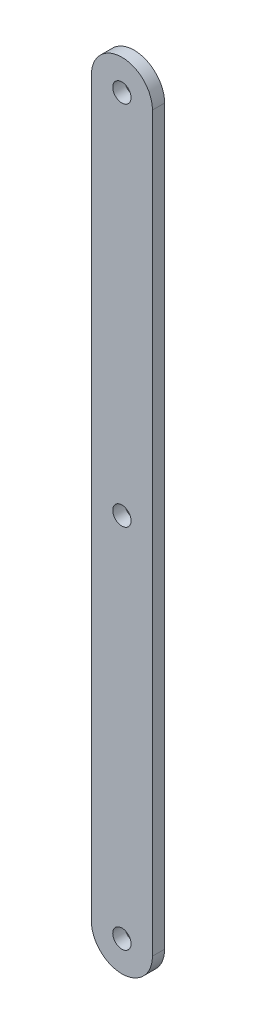
ISO-10303-21;
HEADER;
FILE_DESCRIPTION(('STEP AP214'),'2;1');
FILE_NAME('part.step','',(''),(''),'','','');
FILE_SCHEMA(('AUTOMOTIVE_DESIGN { 1 0 10303 214 1 1 1 1 }'));
ENDSEC;
DATA;
#1=APPLICATION_CONTEXT('core data for automotive mechanical design processes');
#2=APPLICATION_PROTOCOL_DEFINITION('international standard','automotive_design',2000,#1);
#3=PRODUCT_CONTEXT('',#1,'mechanical');
#4=PRODUCT('Part','Part','',(#3));
#5=PRODUCT_RELATED_PRODUCT_CATEGORY('part','',(#4));
#6=PRODUCT_DEFINITION_FORMATION('','',#4);
#7=PRODUCT_DEFINITION_CONTEXT('part definition',#1,'design');
#8=PRODUCT_DEFINITION('design','',#6,#7);
#9=PRODUCT_DEFINITION_SHAPE('','',#8);
#10=(LENGTH_UNIT() NAMED_UNIT(*) SI_UNIT(.MILLI.,.METRE.));
#11=(NAMED_UNIT(*) PLANE_ANGLE_UNIT() SI_UNIT($,.RADIAN.));
#12=(NAMED_UNIT(*) SI_UNIT($,.STERADIAN.) SOLID_ANGLE_UNIT());
#13=UNCERTAINTY_MEASURE_WITH_UNIT(LENGTH_MEASURE(1.E-05),#10,'distance_accuracy_value','');
#14=(GEOMETRIC_REPRESENTATION_CONTEXT(3) GLOBAL_UNCERTAINTY_ASSIGNED_CONTEXT((#13)) GLOBAL_UNIT_ASSIGNED_CONTEXT((#10,
#11,#12)) REPRESENTATION_CONTEXT('',''));
#15=CARTESIAN_POINT('',(0.,0.,0.));
#16=DIRECTION('',(0.,0.,1.));
#17=DIRECTION('',(1.,0.,0.));
#18=AXIS2_PLACEMENT_3D('',#15,#16,#17);
#19=CARTESIAN_POINT('',(0.,60.,2.));
#20=DIRECTION('',(0.,0.,1.));
#21=DIRECTION('',(1.,0.,0.));
#22=AXIS2_PLACEMENT_3D('',#19,#20,#21);
#23=PLANE('',#22);
#24=CARTESIAN_POINT('',(0.,-60.,2.));
#25=DIRECTION('',(0.,0.,1.));
#26=DIRECTION('',(-1.,0.,0.));
#27=AXIS2_PLACEMENT_3D('',#24,#25,#26);
#28=CIRCLE('',#27,1.5);
#29=CARTESIAN_POINT('',(-1.50000000000001,-60.,2.));
#30=VERTEX_POINT('',#29);
#31=EDGE_CURVE('E116',#30,#30,#28,.T.);
#32=ORIENTED_EDGE('',*,*,#31,.F.);
#33=EDGE_LOOP('',(#32));
#34=FACE_BOUND('',#33,.T.);
#35=CARTESIAN_POINT('',(0.,60.,2.));
#36=DIRECTION('',(0.,0.,1.));
#37=DIRECTION('',(1.,0.,0.));
#38=AXIS2_PLACEMENT_3D('',#35,#36,#37);
#39=CIRCLE('',#38,5.);
#40=CARTESIAN_POINT('',(5.00000000000001,60.,2.));
#41=VERTEX_POINT('',#40);
#42=CARTESIAN_POINT('',(-4.99999999999999,60.,2.));
#43=VERTEX_POINT('',#42);
#44=EDGE_CURVE('E86',#41,#43,#39,.T.);
#45=ORIENTED_EDGE('',*,*,#44,.T.);
#46=DIRECTION('',(0.,-1.,0.));
#47=VECTOR('',#46,1.);
#48=CARTESIAN_POINT('',(-4.99999999999999,60.,2.));
#49=LINE('',#48,#47);
#50=CARTESIAN_POINT('',(-5.00000000000001,-60.,2.));
#51=VERTEX_POINT('',#50);
#52=EDGE_CURVE('E81',#43,#51,#49,.T.);
#53=ORIENTED_EDGE('',*,*,#52,.T.);
#54=CARTESIAN_POINT('',(0.,-60.,2.));
#55=DIRECTION('',(0.,0.,1.));
#56=DIRECTION('',(1.,0.,0.));
#57=AXIS2_PLACEMENT_3D('',#54,#55,#56);
#58=CIRCLE('',#57,5.);
#59=CARTESIAN_POINT('',(5.00000000000001,-60.,2.));
#60=VERTEX_POINT('',#59);
#61=EDGE_CURVE('E84',#51,#60,#58,.T.);
#62=ORIENTED_EDGE('',*,*,#61,.T.);
#63=DIRECTION('',(0.,1.,0.));
#64=VECTOR('',#63,1.);
#65=CARTESIAN_POINT('',(5.00000000000001,60.,2.));
#66=LINE('',#65,#64);
#67=EDGE_CURVE('E51',#60,#41,#66,.T.);
#68=ORIENTED_EDGE('',*,*,#67,.T.);
#69=EDGE_LOOP('',(#45,#53,#62,#68));
#70=FACE_BOUND('',#69,.T.);
#71=CARTESIAN_POINT('',(0.,60.,2.));
#72=DIRECTION('',(0.,0.,1.));
#73=DIRECTION('',(1.,0.,0.));
#74=AXIS2_PLACEMENT_3D('',#71,#72,#73);
#75=CIRCLE('',#74,1.5);
#76=CARTESIAN_POINT('',(1.49999999999999,60.,2.));
#77=VERTEX_POINT('',#76);
#78=EDGE_CURVE('E101',#77,#77,#75,.T.);
#79=ORIENTED_EDGE('',*,*,#78,.F.);
#80=EDGE_LOOP('',(#79));
#81=FACE_BOUND('',#80,.T.);
#82=CARTESIAN_POINT('',(0.,0.,2.));
#83=DIRECTION('',(0.,0.,1.));
#84=DIRECTION('',(1.,0.,0.));
#85=AXIS2_PLACEMENT_3D('',#82,#83,#84);
#86=CIRCLE('',#85,1.5);
#87=CARTESIAN_POINT('',(1.5,0.,2.));
#88=VERTEX_POINT('',#87);
#89=EDGE_CURVE('E122',#88,#88,#86,.T.);
#90=ORIENTED_EDGE('',*,*,#89,.F.);
#91=EDGE_LOOP('',(#90));
#92=FACE_BOUND('',#91,.T.);
#93=ADVANCED_FACE('F34',(#34,#70,#81,#92),#23,.T.);
#94=CARTESIAN_POINT('',(0.,60.,0.));
#95=DIRECTION('',(0.,0.,1.));
#96=DIRECTION('',(1.,0.,0.));
#97=AXIS2_PLACEMENT_3D('',#94,#95,#96);
#98=PLANE('',#97);
#99=CARTESIAN_POINT('',(0.,60.,0.));
#100=DIRECTION('',(0.,0.,1.));
#101=DIRECTION('',(1.,0.,0.));
#102=AXIS2_PLACEMENT_3D('',#99,#100,#101);
#103=CIRCLE('',#102,5.);
#104=CARTESIAN_POINT('',(5.00000000000001,60.,0.));
#105=VERTEX_POINT('',#104);
#106=CARTESIAN_POINT('',(-4.99999999999999,60.,0.));
#107=VERTEX_POINT('',#106);
#108=EDGE_CURVE('E98',#105,#107,#103,.T.);
#109=ORIENTED_EDGE('',*,*,#108,.F.);
#110=DIRECTION('',(0.,1.,0.));
#111=VECTOR('',#110,1.);
#112=CARTESIAN_POINT('',(5.00000000000001,60.,0.));
#113=LINE('',#112,#111);
#114=CARTESIAN_POINT('',(5.00000000000001,-60.,0.));
#115=VERTEX_POINT('',#114);
#116=EDGE_CURVE('E74',#115,#105,#113,.T.);
#117=ORIENTED_EDGE('',*,*,#116,.F.);
#118=CARTESIAN_POINT('',(0.,-60.,0.));
#119=DIRECTION('',(0.,0.,1.));
#120=DIRECTION('',(1.,0.,0.));
#121=AXIS2_PLACEMENT_3D('',#118,#119,#120);
#122=CIRCLE('',#121,5.);
#123=CARTESIAN_POINT('',(-5.00000000000001,-60.,0.));
#124=VERTEX_POINT('',#123);
#125=EDGE_CURVE('E68',#124,#115,#122,.T.);
#126=ORIENTED_EDGE('',*,*,#125,.F.);
#127=DIRECTION('',(0.,-1.,0.));
#128=VECTOR('',#127,1.);
#129=CARTESIAN_POINT('',(-4.99999999999999,60.,0.));
#130=LINE('',#129,#128);
#131=EDGE_CURVE('E90',#107,#124,#130,.T.);
#132=ORIENTED_EDGE('',*,*,#131,.F.);
#133=EDGE_LOOP('',(#109,#117,#126,#132));
#134=FACE_BOUND('',#133,.T.);
#135=CARTESIAN_POINT('',(0.,60.,0.));
#136=DIRECTION('',(0.,0.,1.));
#137=DIRECTION('',(1.,0.,0.));
#138=AXIS2_PLACEMENT_3D('',#135,#136,#137);
#139=CIRCLE('',#138,1.5);
#140=CARTESIAN_POINT('',(1.49999999999999,60.,0.));
#141=VERTEX_POINT('',#140);
#142=EDGE_CURVE('E113',#141,#141,#139,.T.);
#143=ORIENTED_EDGE('',*,*,#142,.T.);
#144=EDGE_LOOP('',(#143));
#145=FACE_BOUND('',#144,.T.);
#146=CARTESIAN_POINT('',(0.,-60.,0.));
#147=DIRECTION('',(0.,0.,1.));
#148=DIRECTION('',(-1.,0.,0.));
#149=AXIS2_PLACEMENT_3D('',#146,#147,#148);
#150=CIRCLE('',#149,1.5);
#151=CARTESIAN_POINT('',(-1.50000000000001,-60.,0.));
#152=VERTEX_POINT('',#151);
#153=EDGE_CURVE('E119',#152,#152,#150,.T.);
#154=ORIENTED_EDGE('',*,*,#153,.T.);
#155=EDGE_LOOP('',(#154));
#156=FACE_BOUND('',#155,.T.);
#157=CARTESIAN_POINT('',(0.,0.,0.));
#158=DIRECTION('',(0.,0.,1.));
#159=DIRECTION('',(1.,0.,0.));
#160=AXIS2_PLACEMENT_3D('',#157,#158,#159);
#161=CIRCLE('',#160,1.5);
#162=CARTESIAN_POINT('',(1.5,0.,0.));
#163=VERTEX_POINT('',#162);
#164=EDGE_CURVE('E125',#163,#163,#161,.T.);
#165=ORIENTED_EDGE('',*,*,#164,.T.);
#166=EDGE_LOOP('',(#165));
#167=FACE_BOUND('',#166,.T.);
#168=ADVANCED_FACE('F109',(#134,#145,#156,#167),#98,.F.);
#169=CARTESIAN_POINT('',(0.,60.,2.));
#170=DIRECTION('',(0.,0.,-1.));
#171=DIRECTION('',(-1.,0.,0.));
#172=AXIS2_PLACEMENT_3D('',#169,#170,#171);
#173=CYLINDRICAL_SURFACE('',#172,5.);
#174=ORIENTED_EDGE('',*,*,#108,.T.);
#175=DIRECTION('',(0.,0.,-1.));
#176=VECTOR('',#175,1.);
#177=CARTESIAN_POINT('',(-4.99999999999999,60.,2.));
#178=LINE('',#177,#176);
#179=EDGE_CURVE('E11',#43,#107,#178,.T.);
#180=ORIENTED_EDGE('',*,*,#179,.F.);
#181=ORIENTED_EDGE('',*,*,#44,.F.);
#182=DIRECTION('',(0.,0.,-1.));
#183=VECTOR('',#182,1.);
#184=CARTESIAN_POINT('',(5.00000000000001,60.,2.));
#185=LINE('',#184,#183);
#186=EDGE_CURVE('E94',#41,#105,#185,.T.);
#187=ORIENTED_EDGE('',*,*,#186,.T.);
#188=EDGE_LOOP('',(#174,#180,#181,#187));
#189=FACE_BOUND('',#188,.T.);
#190=ADVANCED_FACE('F36',(#189),#173,.T.);
#191=CARTESIAN_POINT('',(-4.99999999999999,60.,2.));
#192=DIRECTION('',(1.,0.,0.));
#193=DIRECTION('',(0.,0.,-1.));
#194=AXIS2_PLACEMENT_3D('',#191,#192,#193);
#195=PLANE('',#194);
#196=ORIENTED_EDGE('',*,*,#131,.T.);
#197=DIRECTION('',(0.,0.,-1.));
#198=VECTOR('',#197,1.);
#199=CARTESIAN_POINT('',(-5.00000000000001,-60.,2.));
#200=LINE('',#199,#198);
#201=EDGE_CURVE('E43',#51,#124,#200,.T.);
#202=ORIENTED_EDGE('',*,*,#201,.F.);
#203=ORIENTED_EDGE('',*,*,#52,.F.);
#204=ORIENTED_EDGE('',*,*,#179,.T.);
#205=EDGE_LOOP('',(#196,#202,#203,#204));
#206=FACE_BOUND('',#205,.T.);
#207=ADVANCED_FACE('F89',(#206),#195,.F.);
#208=CARTESIAN_POINT('',(0.,-60.,2.));
#209=DIRECTION('',(0.,0.,-1.));
#210=DIRECTION('',(-1.,0.,0.));
#211=AXIS2_PLACEMENT_3D('',#208,#209,#210);
#212=CYLINDRICAL_SURFACE('',#211,5.);
#213=ORIENTED_EDGE('',*,*,#125,.T.);
#214=DIRECTION('',(0.,0.,-1.));
#215=VECTOR('',#214,1.);
#216=CARTESIAN_POINT('',(5.00000000000001,-60.,2.));
#217=LINE('',#216,#215);
#218=EDGE_CURVE('E91',#60,#115,#217,.T.);
#219=ORIENTED_EDGE('',*,*,#218,.F.);
#220=ORIENTED_EDGE('',*,*,#61,.F.);
#221=ORIENTED_EDGE('',*,*,#201,.T.);
#222=EDGE_LOOP('',(#213,#219,#220,#221));
#223=FACE_BOUND('',#222,.T.);
#224=ADVANCED_FACE('F92',(#223),#212,.T.);
#225=CARTESIAN_POINT('',(5.00000000000001,60.,2.));
#226=DIRECTION('',(-1.,0.,0.));
#227=DIRECTION('',(0.,0.,1.));
#228=AXIS2_PLACEMENT_3D('',#225,#226,#227);
#229=PLANE('',#228);
#230=ORIENTED_EDGE('',*,*,#116,.T.);
#231=ORIENTED_EDGE('',*,*,#186,.F.);
#232=ORIENTED_EDGE('',*,*,#67,.F.);
#233=ORIENTED_EDGE('',*,*,#218,.T.);
#234=EDGE_LOOP('',(#230,#231,#232,#233));
#235=FACE_BOUND('',#234,.T.);
#236=ADVANCED_FACE('F106',(#235),#229,.F.);
#237=CARTESIAN_POINT('',(0.,60.,2.));
#238=DIRECTION('',(0.,0.,-1.));
#239=DIRECTION('',(-1.,0.,0.));
#240=AXIS2_PLACEMENT_3D('',#237,#238,#239);
#241=CYLINDRICAL_SURFACE('',#240,1.5);
#242=ORIENTED_EDGE('',*,*,#78,.T.);
#243=EDGE_LOOP('',(#242));
#244=FACE_BOUND('',#243,.T.);
#245=ORIENTED_EDGE('',*,*,#142,.F.);
#246=EDGE_LOOP('',(#245));
#247=FACE_BOUND('',#246,.T.);
#248=ADVANCED_FACE('F143',(#244,#247),#241,.F.);
#249=CARTESIAN_POINT('',(0.,-60.,2.));
#250=DIRECTION('',(0.,0.,-1.));
#251=DIRECTION('',(-1.,0.,0.));
#252=AXIS2_PLACEMENT_3D('',#249,#250,#251);
#253=CYLINDRICAL_SURFACE('',#252,1.5);
#254=ORIENTED_EDGE('',*,*,#31,.T.);
#255=EDGE_LOOP('',(#254));
#256=FACE_BOUND('',#255,.T.);
#257=ORIENTED_EDGE('',*,*,#153,.F.);
#258=EDGE_LOOP('',(#257));
#259=FACE_BOUND('',#258,.T.);
#260=ADVANCED_FACE('F189',(#256,#259),#253,.F.);
#261=CARTESIAN_POINT('',(0.,0.,2.));
#262=DIRECTION('',(0.,0.,-1.));
#263=DIRECTION('',(-1.,0.,0.));
#264=AXIS2_PLACEMENT_3D('',#261,#262,#263);
#265=CYLINDRICAL_SURFACE('',#264,1.5);
#266=ORIENTED_EDGE('',*,*,#89,.T.);
#267=EDGE_LOOP('',(#266));
#268=FACE_BOUND('',#267,.T.);
#269=ORIENTED_EDGE('',*,*,#164,.F.);
#270=EDGE_LOOP('',(#269));
#271=FACE_BOUND('',#270,.T.);
#272=ADVANCED_FACE('F131',(#268,#271),#265,.F.);
#273=CLOSED_SHELL('',(#93,#168,#190,#207,#224,#236,#248,#260,#272));
#274=MANIFOLD_SOLID_BREP('B2',#273);
#275=ADVANCED_BREP_SHAPE_REPRESENTATION('',(#18,#274),#14);
#276=SHAPE_DEFINITION_REPRESENTATION(#9,#275);
ENDSEC;
END-ISO-10303-21;
